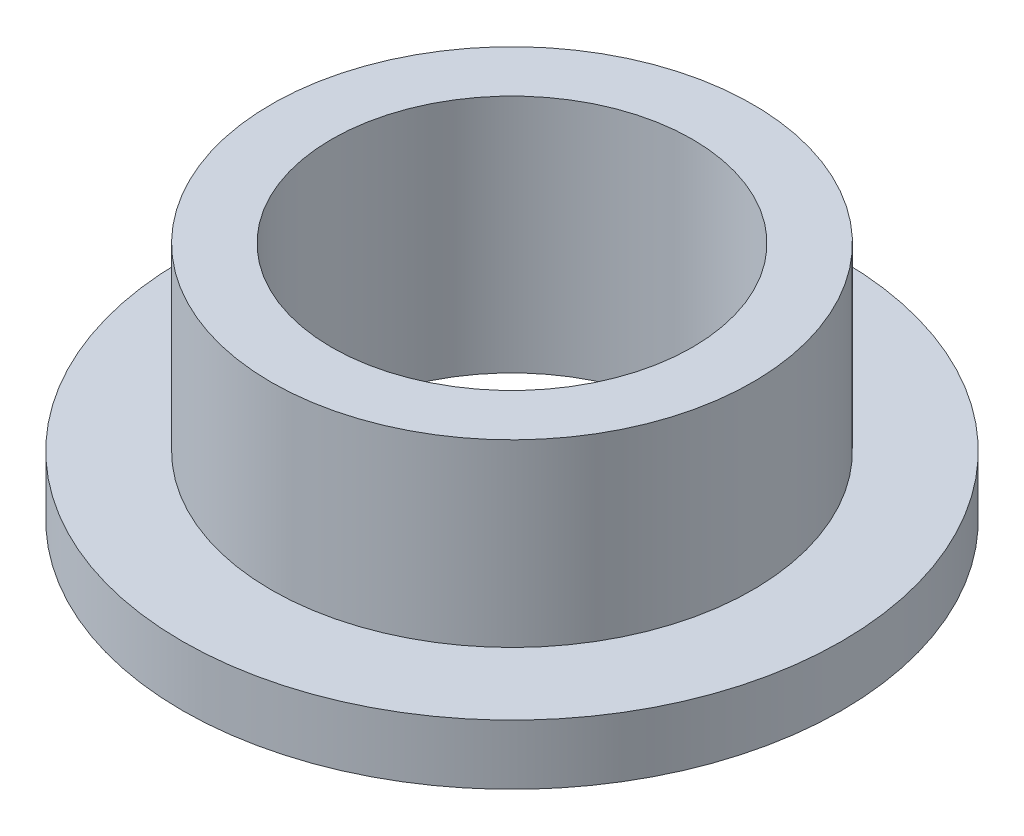
ISO-10303-21;
HEADER;
FILE_DESCRIPTION(('STEP AP214'),'2;1');
FILE_NAME('part.step','',(''),(''),'','','');
FILE_SCHEMA(('AUTOMOTIVE_DESIGN { 1 0 10303 214 1 1 1 1 }'));
ENDSEC;
DATA;
#1=APPLICATION_CONTEXT('core data for automotive mechanical design processes');
#2=APPLICATION_PROTOCOL_DEFINITION('international standard','automotive_design',2000,#1);
#3=PRODUCT_CONTEXT('',#1,'mechanical');
#4=PRODUCT('Part','Part','',(#3));
#5=PRODUCT_RELATED_PRODUCT_CATEGORY('part','',(#4));
#6=PRODUCT_DEFINITION_FORMATION('','',#4);
#7=PRODUCT_DEFINITION_CONTEXT('part definition',#1,'design');
#8=PRODUCT_DEFINITION('design','',#6,#7);
#9=PRODUCT_DEFINITION_SHAPE('','',#8);
#10=(LENGTH_UNIT() NAMED_UNIT(*) SI_UNIT(.MILLI.,.METRE.));
#11=(NAMED_UNIT(*) PLANE_ANGLE_UNIT() SI_UNIT($,.RADIAN.));
#12=(NAMED_UNIT(*) SI_UNIT($,.STERADIAN.) SOLID_ANGLE_UNIT());
#13=UNCERTAINTY_MEASURE_WITH_UNIT(LENGTH_MEASURE(1.E-05),#10,'distance_accuracy_value','');
#14=(GEOMETRIC_REPRESENTATION_CONTEXT(3) GLOBAL_UNCERTAINTY_ASSIGNED_CONTEXT((#13)) GLOBAL_UNIT_ASSIGNED_CONTEXT((#10,
#11,#12)) REPRESENTATION_CONTEXT('',''));
#15=CARTESIAN_POINT('',(0.,0.,0.));
#16=DIRECTION('',(0.,0.,1.));
#17=DIRECTION('',(1.,0.,0.));
#18=AXIS2_PLACEMENT_3D('',#15,#16,#17);
#19=CARTESIAN_POINT('',(0.,6.35,0.));
#20=DIRECTION('',(0.,1.,0.));
#21=DIRECTION('',(0.,0.,1.));
#22=AXIS2_PLACEMENT_3D('',#19,#20,#21);
#23=PLANE('',#22);
#24=CARTESIAN_POINT('',(0.,6.35,0.));
#25=DIRECTION('',(0.,1.,0.));
#26=DIRECTION('',(0.,0.,1.));
#27=AXIS2_PLACEMENT_3D('',#24,#25,#26);
#28=CIRCLE('',#27,6.3754);
#29=CARTESIAN_POINT('',(0.,6.35,6.3754));
#30=VERTEX_POINT('',#29);
#31=EDGE_CURVE('E10',#30,#30,#28,.T.);
#32=ORIENTED_EDGE('',*,*,#31,.T.);
#33=EDGE_LOOP('',(#32));
#34=FACE_BOUND('',#33,.T.);
#35=CARTESIAN_POINT('',(0.,6.35,0.));
#36=DIRECTION('',(0.,1.,0.));
#37=DIRECTION('',(0.,0.,1.));
#38=AXIS2_PLACEMENT_3D('',#35,#36,#37);
#39=CIRCLE('',#38,4.7752);
#40=CARTESIAN_POINT('',(0.,6.35,4.7752));
#41=VERTEX_POINT('',#40);
#42=EDGE_CURVE('E37',#41,#41,#39,.T.);
#43=ORIENTED_EDGE('',*,*,#42,.F.);
#44=EDGE_LOOP('',(#43));
#45=FACE_BOUND('',#44,.T.);
#46=ADVANCED_FACE('F30',(#34,#45),#23,.T.);
#47=CARTESIAN_POINT('',(0.,0.,0.));
#48=DIRECTION('',(0.,1.,0.));
#49=DIRECTION('',(0.,0.,1.));
#50=AXIS2_PLACEMENT_3D('',#47,#48,#49);
#51=PLANE('',#50);
#52=CARTESIAN_POINT('',(0.,0.,0.));
#53=DIRECTION('',(0.,1.,0.));
#54=DIRECTION('',(0.,0.,1.));
#55=AXIS2_PLACEMENT_3D('',#52,#53,#54);
#56=CIRCLE('',#55,4.7752);
#57=CARTESIAN_POINT('',(0.,0.,4.7752));
#58=VERTEX_POINT('',#57);
#59=EDGE_CURVE('E41',#58,#58,#56,.T.);
#60=ORIENTED_EDGE('',*,*,#59,.T.);
#61=EDGE_LOOP('',(#60));
#62=FACE_BOUND('',#61,.T.);
#63=CARTESIAN_POINT('',(0.,0.,0.));
#64=DIRECTION('',(0.,1.,0.));
#65=DIRECTION('',(0.,0.,1.));
#66=AXIS2_PLACEMENT_3D('',#63,#64,#65);
#67=CIRCLE('',#66,8.73125);
#68=CARTESIAN_POINT('',(0.,0.,8.73125));
#69=VERTEX_POINT('',#68);
#70=EDGE_CURVE('E48',#69,#69,#67,.T.);
#71=ORIENTED_EDGE('',*,*,#70,.F.);
#72=EDGE_LOOP('',(#71));
#73=FACE_BOUND('',#72,.T.);
#74=ADVANCED_FACE('F73',(#62,#73),#51,.F.);
#75=CARTESIAN_POINT('',(0.,6.35,0.));
#76=DIRECTION('',(0.,-1.,0.));
#77=DIRECTION('',(0.,0.,-1.));
#78=AXIS2_PLACEMENT_3D('',#75,#76,#77);
#79=CYLINDRICAL_SURFACE('',#78,6.3754);
#80=CARTESIAN_POINT('',(0.,1.5875,0.));
#81=DIRECTION('',(0.,1.,0.));
#82=DIRECTION('',(0.,0.,1.));
#83=AXIS2_PLACEMENT_3D('',#80,#81,#82);
#84=CIRCLE('',#83,6.3754);
#85=CARTESIAN_POINT('',(0.,1.5875,6.3754));
#86=VERTEX_POINT('',#85);
#87=EDGE_CURVE('E51',#86,#86,#84,.T.);
#88=ORIENTED_EDGE('',*,*,#87,.T.);
#89=EDGE_LOOP('',(#88));
#90=FACE_BOUND('',#89,.T.);
#91=ORIENTED_EDGE('',*,*,#31,.F.);
#92=EDGE_LOOP('',(#91));
#93=FACE_BOUND('',#92,.T.);
#94=ADVANCED_FACE('F32',(#90,#93),#79,.T.);
#95=CARTESIAN_POINT('',(0.,6.35,0.));
#96=DIRECTION('',(0.,-1.,0.));
#97=DIRECTION('',(0.,0.,-1.));
#98=AXIS2_PLACEMENT_3D('',#95,#96,#97);
#99=CYLINDRICAL_SURFACE('',#98,4.7752);
#100=ORIENTED_EDGE('',*,*,#42,.T.);
#101=EDGE_LOOP('',(#100));
#102=FACE_BOUND('',#101,.T.);
#103=ORIENTED_EDGE('',*,*,#59,.F.);
#104=EDGE_LOOP('',(#103));
#105=FACE_BOUND('',#104,.T.);
#106=ADVANCED_FACE('F62',(#102,#105),#99,.F.);
#107=CARTESIAN_POINT('',(0.,1.5875,0.));
#108=DIRECTION('',(0.,1.,0.));
#109=DIRECTION('',(0.,0.,1.));
#110=AXIS2_PLACEMENT_3D('',#107,#108,#109);
#111=PLANE('',#110);
#112=CARTESIAN_POINT('',(0.,1.5875,0.));
#113=DIRECTION('',(0.,1.,0.));
#114=DIRECTION('',(0.,0.,1.));
#115=AXIS2_PLACEMENT_3D('',#112,#113,#114);
#116=CIRCLE('',#115,8.73125);
#117=CARTESIAN_POINT('',(0.,1.5875,8.73125));
#118=VERTEX_POINT('',#117);
#119=EDGE_CURVE('E46',#118,#118,#116,.T.);
#120=ORIENTED_EDGE('',*,*,#119,.T.);
#121=EDGE_LOOP('',(#120));
#122=FACE_BOUND('',#121,.T.);
#123=ORIENTED_EDGE('',*,*,#87,.F.);
#124=EDGE_LOOP('',(#123));
#125=FACE_BOUND('',#124,.T.);
#126=ADVANCED_FACE('F59',(#122,#125),#111,.T.);
#127=CARTESIAN_POINT('',(0.,1.5875,0.));
#128=DIRECTION('',(0.,-1.,0.));
#129=DIRECTION('',(0.,0.,-1.));
#130=AXIS2_PLACEMENT_3D('',#127,#128,#129);
#131=CYLINDRICAL_SURFACE('',#130,8.73125);
#132=ORIENTED_EDGE('',*,*,#119,.F.);
#133=EDGE_LOOP('',(#132));
#134=FACE_BOUND('',#133,.T.);
#135=ORIENTED_EDGE('',*,*,#70,.T.);
#136=EDGE_LOOP('',(#135));
#137=FACE_BOUND('',#136,.T.);
#138=ADVANCED_FACE('F61',(#134,#137),#131,.T.);
#139=CLOSED_SHELL('',(#46,#74,#94,#106,#126,#138));
#140=MANIFOLD_SOLID_BREP('B2',#139);
#141=ADVANCED_BREP_SHAPE_REPRESENTATION('',(#18,#140),#14);
#142=SHAPE_DEFINITION_REPRESENTATION(#9,#141);
ENDSEC;
END-ISO-10303-21;
